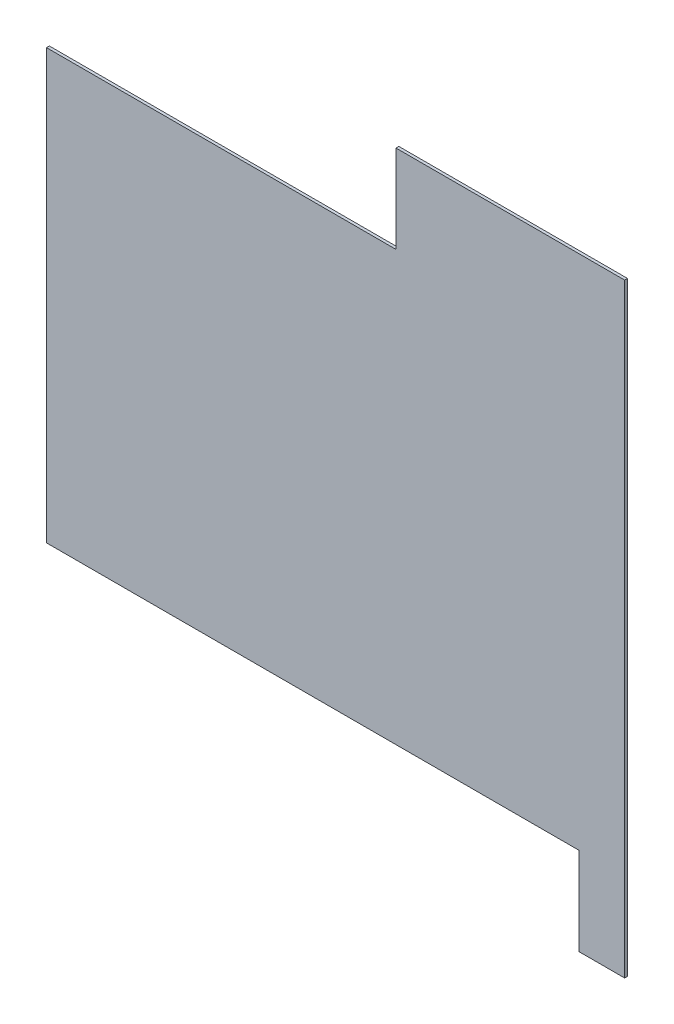
ISO-10303-21;
HEADER;
FILE_DESCRIPTION(('STEP AP214'),'2;1');
FILE_NAME('part.step','',(''),(''),'','','');
FILE_SCHEMA(('AUTOMOTIVE_DESIGN { 1 0 10303 214 1 1 1 1 }'));
ENDSEC;
DATA;
#1=APPLICATION_CONTEXT('core data for automotive mechanical design processes');
#2=APPLICATION_PROTOCOL_DEFINITION('international standard','automotive_design',2000,#1);
#3=PRODUCT_CONTEXT('',#1,'mechanical');
#4=PRODUCT('Part','Part','',(#3));
#5=PRODUCT_RELATED_PRODUCT_CATEGORY('part','',(#4));
#6=PRODUCT_DEFINITION_FORMATION('','',#4);
#7=PRODUCT_DEFINITION_CONTEXT('part definition',#1,'design');
#8=PRODUCT_DEFINITION('design','',#6,#7);
#9=PRODUCT_DEFINITION_SHAPE('','',#8);
#10=(LENGTH_UNIT() NAMED_UNIT(*) SI_UNIT(.MILLI.,.METRE.));
#11=(NAMED_UNIT(*) PLANE_ANGLE_UNIT() SI_UNIT($,.RADIAN.));
#12=(NAMED_UNIT(*) SI_UNIT($,.STERADIAN.) SOLID_ANGLE_UNIT());
#13=UNCERTAINTY_MEASURE_WITH_UNIT(LENGTH_MEASURE(1.E-05),#10,'distance_accuracy_value','');
#14=(GEOMETRIC_REPRESENTATION_CONTEXT(3) GLOBAL_UNCERTAINTY_ASSIGNED_CONTEXT((#13)) GLOBAL_UNIT_ASSIGNED_CONTEXT((#10,
#11,#12)) REPRESENTATION_CONTEXT('',''));
#15=CARTESIAN_POINT('',(0.,0.,0.));
#16=DIRECTION('',(0.,0.,1.));
#17=DIRECTION('',(1.,0.,0.));
#18=AXIS2_PLACEMENT_3D('',#15,#16,#17);
#19=CARTESIAN_POINT('',(2035.,1819.,10.));
#20=DIRECTION('',(0.,-1.,0.));
#21=DIRECTION('',(1.,0.,0.));
#22=AXIS2_PLACEMENT_3D('',#19,#20,#21);
#23=PLANE('',#22);
#24=DIRECTION('',(-1.,0.,0.));
#25=VECTOR('',#24,1.);
#26=CARTESIAN_POINT('',(2035.,1819.,0.));
#27=LINE('',#26,#25);
#28=CARTESIAN_POINT('',(2035.,1819.,0.));
#29=VERTEX_POINT('',#28);
#30=CARTESIAN_POINT('',(1230.,1819.,0.));
#31=VERTEX_POINT('',#30);
#32=EDGE_CURVE('E145',#29,#31,#27,.T.);
#33=ORIENTED_EDGE('',*,*,#32,.T.);
#34=DIRECTION('',(0.,0.,-1.));
#35=VECTOR('',#34,1.);
#36=CARTESIAN_POINT('',(1230.,1819.,10.));
#37=LINE('',#36,#35);
#38=CARTESIAN_POINT('',(1230.,1819.,10.));
#39=VERTEX_POINT('',#38);
#40=EDGE_CURVE('E11',#39,#31,#37,.T.);
#41=ORIENTED_EDGE('',*,*,#40,.F.);
#42=DIRECTION('',(-1.,0.,0.));
#43=VECTOR('',#42,1.);
#44=CARTESIAN_POINT('',(2035.,1819.,10.));
#45=LINE('',#44,#43);
#46=CARTESIAN_POINT('',(2035.,1819.,10.));
#47=VERTEX_POINT('',#46);
#48=EDGE_CURVE('E165',#47,#39,#45,.T.);
#49=ORIENTED_EDGE('',*,*,#48,.F.);
#50=DIRECTION('',(0.,0.,-1.));
#51=VECTOR('',#50,1.);
#52=CARTESIAN_POINT('',(2035.,1819.,10.));
#53=LINE('',#52,#51);
#54=EDGE_CURVE('E144',#47,#29,#53,.T.);
#55=ORIENTED_EDGE('',*,*,#54,.T.);
#56=EDGE_LOOP('',(#33,#41,#49,#55));
#57=FACE_BOUND('',#56,.T.);
#58=ADVANCED_FACE('F39',(#57),#23,.F.);
#59=CARTESIAN_POINT('',(1230.,1819.,10.));
#60=DIRECTION('',(1.,0.,0.));
#61=DIRECTION('',(0.,0.,-1.));
#62=AXIS2_PLACEMENT_3D('',#59,#60,#61);
#63=PLANE('',#62);
#64=DIRECTION('',(0.,-1.,0.));
#65=VECTOR('',#64,1.);
#66=CARTESIAN_POINT('',(1230.,1819.,0.));
#67=LINE('',#66,#65);
#68=CARTESIAN_POINT('',(1230.,1510.,0.));
#69=VERTEX_POINT('',#68);
#70=EDGE_CURVE('E149',#31,#69,#67,.T.);
#71=ORIENTED_EDGE('',*,*,#70,.T.);
#72=DIRECTION('',(0.,0.,-1.));
#73=VECTOR('',#72,1.);
#74=CARTESIAN_POINT('',(1230.,1510.,10.));
#75=LINE('',#74,#73);
#76=CARTESIAN_POINT('',(1230.,1510.,10.));
#77=VERTEX_POINT('',#76);
#78=EDGE_CURVE('E48',#77,#69,#75,.T.);
#79=ORIENTED_EDGE('',*,*,#78,.F.);
#80=DIRECTION('',(0.,-1.,0.));
#81=VECTOR('',#80,1.);
#82=CARTESIAN_POINT('',(1230.,1819.,10.));
#83=LINE('',#82,#81);
#84=EDGE_CURVE('E94',#39,#77,#83,.T.);
#85=ORIENTED_EDGE('',*,*,#84,.F.);
#86=ORIENTED_EDGE('',*,*,#40,.T.);
#87=EDGE_LOOP('',(#71,#79,#85,#86));
#88=FACE_BOUND('',#87,.T.);
#89=ADVANCED_FACE('F203',(#88),#63,.F.);
#90=CARTESIAN_POINT('',(1230.,1510.,10.));
#91=DIRECTION('',(0.,-1.,0.));
#92=DIRECTION('',(0.,0.,-1.));
#93=AXIS2_PLACEMENT_3D('',#90,#91,#92);
#94=PLANE('',#93);
#95=DIRECTION('',(-1.,0.,0.));
#96=VECTOR('',#95,1.);
#97=CARTESIAN_POINT('',(1230.,1510.,0.));
#98=LINE('',#97,#96);
#99=CARTESIAN_POINT('',(0.,1510.,0.));
#100=VERTEX_POINT('',#99);
#101=EDGE_CURVE('E153',#69,#100,#98,.T.);
#102=ORIENTED_EDGE('',*,*,#101,.T.);
#103=DIRECTION('',(0.,0.,-1.));
#104=VECTOR('',#103,1.);
#105=CARTESIAN_POINT('',(0.,1510.,10.));
#106=LINE('',#105,#104);
#107=CARTESIAN_POINT('',(0.,1510.,10.));
#108=VERTEX_POINT('',#107);
#109=EDGE_CURVE('E128',#108,#100,#106,.T.);
#110=ORIENTED_EDGE('',*,*,#109,.F.);
#111=DIRECTION('',(-1.,0.,0.));
#112=VECTOR('',#111,1.);
#113=CARTESIAN_POINT('',(1230.,1510.,10.));
#114=LINE('',#113,#112);
#115=EDGE_CURVE('E113',#77,#108,#114,.T.);
#116=ORIENTED_EDGE('',*,*,#115,.F.);
#117=ORIENTED_EDGE('',*,*,#78,.T.);
#118=EDGE_LOOP('',(#102,#110,#116,#117));
#119=FACE_BOUND('',#118,.T.);
#120=ADVANCED_FACE('F175',(#119),#94,.F.);
#121=CARTESIAN_POINT('',(0.,1510.,10.));
#122=DIRECTION('',(1.,0.,0.));
#123=DIRECTION('',(0.,1.,0.));
#124=AXIS2_PLACEMENT_3D('',#121,#122,#123);
#125=PLANE('',#124);
#126=DIRECTION('',(0.,-1.,0.));
#127=VECTOR('',#126,1.);
#128=CARTESIAN_POINT('',(0.,1510.,0.));
#129=LINE('',#128,#127);
#130=CARTESIAN_POINT('',(0.,0.,0.));
#131=VERTEX_POINT('',#130);
#132=EDGE_CURVE('E123',#100,#131,#129,.T.);
#133=ORIENTED_EDGE('',*,*,#132,.T.);
#134=DIRECTION('',(0.,0.,-1.));
#135=VECTOR('',#134,1.);
#136=CARTESIAN_POINT('',(0.,0.,10.));
#137=LINE('',#136,#135);
#138=CARTESIAN_POINT('',(0.,0.,10.));
#139=VERTEX_POINT('',#138);
#140=EDGE_CURVE('E120',#139,#131,#137,.T.);
#141=ORIENTED_EDGE('',*,*,#140,.F.);
#142=DIRECTION('',(0.,-1.,0.));
#143=VECTOR('',#142,1.);
#144=CARTESIAN_POINT('',(0.,1510.,10.));
#145=LINE('',#144,#143);
#146=EDGE_CURVE('E105',#108,#139,#145,.T.);
#147=ORIENTED_EDGE('',*,*,#146,.F.);
#148=ORIENTED_EDGE('',*,*,#109,.T.);
#149=EDGE_LOOP('',(#133,#141,#147,#148));
#150=FACE_BOUND('',#149,.T.);
#151=ADVANCED_FACE('F121',(#150),#125,.F.);
#152=CARTESIAN_POINT('',(1685.,0.,10.));
#153=DIRECTION('',(0.,1.,0.));
#154=DIRECTION('',(-1.,0.,0.));
#155=AXIS2_PLACEMENT_3D('',#152,#153,#154);
#156=PLANE('',#155);
#157=DIRECTION('',(1.,0.,0.));
#158=VECTOR('',#157,1.);
#159=CARTESIAN_POINT('',(1685.,0.,0.));
#160=LINE('',#159,#158);
#161=CARTESIAN_POINT('',(1875.,0.,0.));
#162=VERTEX_POINT('',#161);
#163=EDGE_CURVE('E158',#131,#162,#160,.T.);
#164=ORIENTED_EDGE('',*,*,#163,.T.);
#165=DIRECTION('',(0.,0.,-1.));
#166=VECTOR('',#165,1.);
#167=CARTESIAN_POINT('',(1875.,0.,10.));
#168=LINE('',#167,#166);
#169=CARTESIAN_POINT('',(1875.,0.,10.));
#170=VERTEX_POINT('',#169);
#171=EDGE_CURVE('E133',#170,#162,#168,.T.);
#172=ORIENTED_EDGE('',*,*,#171,.F.);
#173=DIRECTION('',(1.,0.,0.));
#174=VECTOR('',#173,1.);
#175=CARTESIAN_POINT('',(1685.,0.,10.));
#176=LINE('',#175,#174);
#177=EDGE_CURVE('E110',#139,#170,#176,.T.);
#178=ORIENTED_EDGE('',*,*,#177,.F.);
#179=ORIENTED_EDGE('',*,*,#140,.T.);
#180=EDGE_LOOP('',(#164,#172,#178,#179));
#181=FACE_BOUND('',#180,.T.);
#182=ADVANCED_FACE('F131',(#181),#156,.F.);
#183=CARTESIAN_POINT('',(1685.,-309.,10.));
#184=DIRECTION('',(0.,1.,0.));
#185=DIRECTION('',(0.,0.,1.));
#186=AXIS2_PLACEMENT_3D('',#183,#184,#185);
#187=PLANE('',#186);
#188=DIRECTION('',(1.,0.,0.));
#189=VECTOR('',#188,1.);
#190=CARTESIAN_POINT('',(1685.,-309.,10.));
#191=LINE('',#190,#189);
#192=CARTESIAN_POINT('',(1875.,-309.,10.));
#193=VERTEX_POINT('',#192);
#194=CARTESIAN_POINT('',(2035.,-309.,10.));
#195=VERTEX_POINT('',#194);
#196=EDGE_CURVE('E136',#193,#195,#191,.T.);
#197=ORIENTED_EDGE('',*,*,#196,.F.);
#198=DIRECTION('',(0.,0.,-1.));
#199=VECTOR('',#198,1.);
#200=CARTESIAN_POINT('',(1875.,-309.,10.));
#201=LINE('',#200,#199);
#202=CARTESIAN_POINT('',(1875.,-309.,0.));
#203=VERTEX_POINT('',#202);
#204=EDGE_CURVE('E150',#193,#203,#201,.T.);
#205=ORIENTED_EDGE('',*,*,#204,.T.);
#206=DIRECTION('',(1.,0.,0.));
#207=VECTOR('',#206,1.);
#208=CARTESIAN_POINT('',(1685.,-309.,0.));
#209=LINE('',#208,#207);
#210=CARTESIAN_POINT('',(2035.,-309.,0.));
#211=VERTEX_POINT('',#210);
#212=EDGE_CURVE('E80',#203,#211,#209,.T.);
#213=ORIENTED_EDGE('',*,*,#212,.T.);
#214=DIRECTION('',(0.,0.,-1.));
#215=VECTOR('',#214,1.);
#216=CARTESIAN_POINT('',(2035.,-309.,10.));
#217=LINE('',#216,#215);
#218=EDGE_CURVE('E129',#195,#211,#217,.T.);
#219=ORIENTED_EDGE('',*,*,#218,.F.);
#220=EDGE_LOOP('',(#197,#205,#213,#219));
#221=FACE_BOUND('',#220,.T.);
#222=ADVANCED_FACE('F215',(#221),#187,.F.);
#223=CARTESIAN_POINT('',(2035.,-309.,10.));
#224=DIRECTION('',(-1.,0.,0.));
#225=DIRECTION('',(0.,0.,1.));
#226=AXIS2_PLACEMENT_3D('',#223,#224,#225);
#227=PLANE('',#226);
#228=DIRECTION('',(0.,1.,0.));
#229=VECTOR('',#228,1.);
#230=CARTESIAN_POINT('',(2035.,-309.,0.));
#231=LINE('',#230,#229);
#232=EDGE_CURVE('E86',#211,#29,#231,.T.);
#233=ORIENTED_EDGE('',*,*,#232,.T.);
#234=ORIENTED_EDGE('',*,*,#54,.F.);
#235=DIRECTION('',(0.,1.,0.));
#236=VECTOR('',#235,1.);
#237=CARTESIAN_POINT('',(2035.,-309.,10.));
#238=LINE('',#237,#236);
#239=EDGE_CURVE('E56',#195,#47,#238,.T.);
#240=ORIENTED_EDGE('',*,*,#239,.F.);
#241=ORIENTED_EDGE('',*,*,#218,.T.);
#242=EDGE_LOOP('',(#233,#234,#240,#241));
#243=FACE_BOUND('',#242,.T.);
#244=ADVANCED_FACE('F218',(#243),#227,.F.);
#245=CARTESIAN_POINT('',(0.,0.,10.));
#246=DIRECTION('',(0.,0.,1.));
#247=DIRECTION('',(1.,0.,0.));
#248=AXIS2_PLACEMENT_3D('',#245,#246,#247);
#249=PLANE('',#248);
#250=DIRECTION('',(0.,-1.,0.));
#251=VECTOR('',#250,1.);
#252=CARTESIAN_POINT('',(1875.,0.,10.));
#253=LINE('',#252,#251);
#254=EDGE_CURVE('E187',#170,#193,#253,.T.);
#255=ORIENTED_EDGE('',*,*,#254,.T.);
#256=ORIENTED_EDGE('',*,*,#196,.T.);
#257=ORIENTED_EDGE('',*,*,#239,.T.);
#258=ORIENTED_EDGE('',*,*,#48,.T.);
#259=ORIENTED_EDGE('',*,*,#84,.T.);
#260=ORIENTED_EDGE('',*,*,#115,.T.);
#261=ORIENTED_EDGE('',*,*,#146,.T.);
#262=ORIENTED_EDGE('',*,*,#177,.T.);
#263=EDGE_LOOP('',(#255,#256,#257,#258,#259,#260,#261,#262));
#264=FACE_BOUND('',#263,.T.);
#265=ADVANCED_FACE('F108',(#264),#249,.T.);
#266=CARTESIAN_POINT('',(0.,0.,0.));
#267=DIRECTION('',(0.,0.,1.));
#268=DIRECTION('',(1.,0.,0.));
#269=AXIS2_PLACEMENT_3D('',#266,#267,#268);
#270=PLANE('',#269);
#271=ORIENTED_EDGE('',*,*,#212,.F.);
#272=DIRECTION('',(0.,-1.,0.));
#273=VECTOR('',#272,1.);
#274=CARTESIAN_POINT('',(1875.,0.,0.));
#275=LINE('',#274,#273);
#276=EDGE_CURVE('E181',#162,#203,#275,.T.);
#277=ORIENTED_EDGE('',*,*,#276,.F.);
#278=ORIENTED_EDGE('',*,*,#163,.F.);
#279=ORIENTED_EDGE('',*,*,#132,.F.);
#280=ORIENTED_EDGE('',*,*,#101,.F.);
#281=ORIENTED_EDGE('',*,*,#70,.F.);
#282=ORIENTED_EDGE('',*,*,#32,.F.);
#283=ORIENTED_EDGE('',*,*,#232,.F.);
#284=EDGE_LOOP('',(#271,#277,#278,#279,#280,#281,#282,#283));
#285=FACE_BOUND('',#284,.T.);
#286=ADVANCED_FACE('F177',(#285),#270,.F.);
#287=CARTESIAN_POINT('',(1875.,0.,10.));
#288=DIRECTION('',(1.,0.,0.));
#289=DIRECTION('',(0.,0.,-1.));
#290=AXIS2_PLACEMENT_3D('',#287,#288,#289);
#291=PLANE('',#290);
#292=ORIENTED_EDGE('',*,*,#276,.T.);
#293=ORIENTED_EDGE('',*,*,#204,.F.);
#294=ORIENTED_EDGE('',*,*,#254,.F.);
#295=ORIENTED_EDGE('',*,*,#171,.T.);
#296=EDGE_LOOP('',(#292,#293,#294,#295));
#297=FACE_BOUND('',#296,.T.);
#298=ADVANCED_FACE('F185',(#297),#291,.F.);
#299=CLOSED_SHELL('',(#58,#89,#120,#151,#182,#222,#244,#265,#286,#298));
#300=MANIFOLD_SOLID_BREP('B2',#299);
#301=ADVANCED_BREP_SHAPE_REPRESENTATION('',(#18,#300),#14);
#302=SHAPE_DEFINITION_REPRESENTATION(#9,#301);
ENDSEC;
END-ISO-10303-21;
